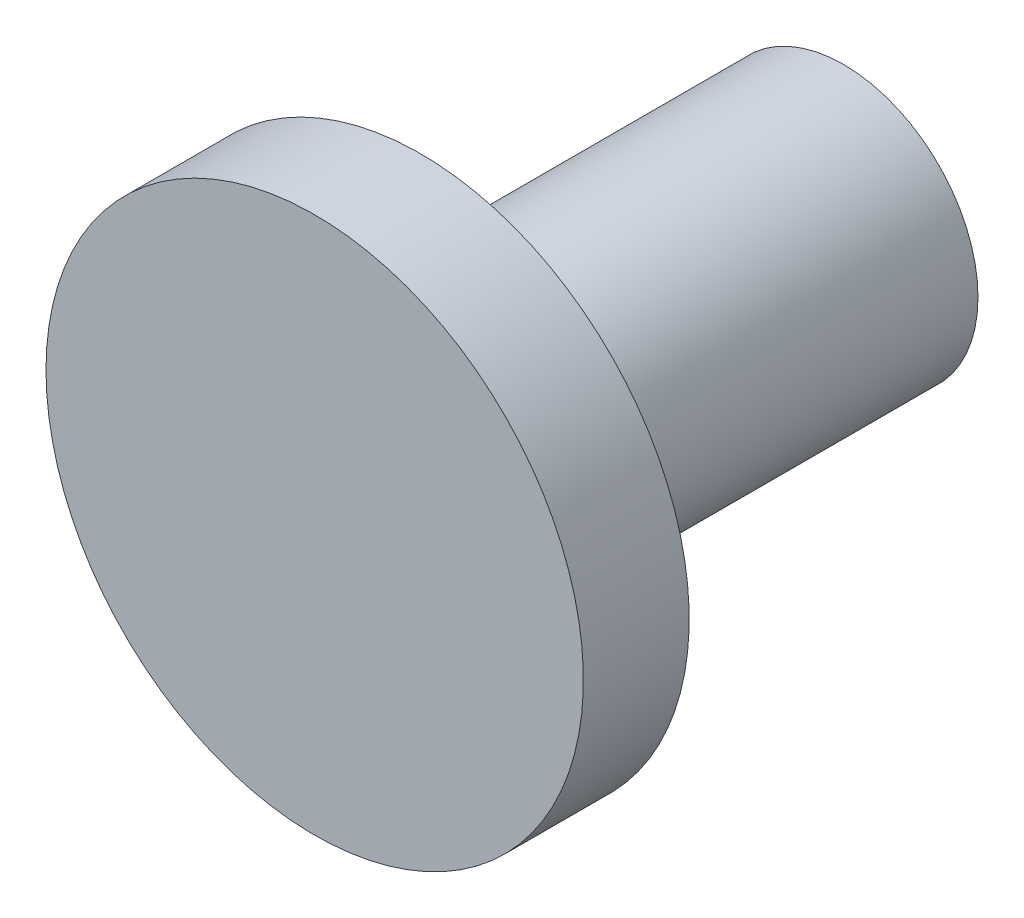
ISO-10303-21;
HEADER;
FILE_DESCRIPTION(('STEP AP214'),'2;1');
FILE_NAME('part.step','',(''),(''),'','','');
FILE_SCHEMA(('AUTOMOTIVE_DESIGN { 1 0 10303 214 1 1 1 1 }'));
ENDSEC;
DATA;
#1=APPLICATION_CONTEXT('core data for automotive mechanical design processes');
#2=APPLICATION_PROTOCOL_DEFINITION('international standard','automotive_design',2000,#1);
#3=PRODUCT_CONTEXT('',#1,'mechanical');
#4=PRODUCT('Part','Part','',(#3));
#5=PRODUCT_RELATED_PRODUCT_CATEGORY('part','',(#4));
#6=PRODUCT_DEFINITION_FORMATION('','',#4);
#7=PRODUCT_DEFINITION_CONTEXT('part definition',#1,'design');
#8=PRODUCT_DEFINITION('design','',#6,#7);
#9=PRODUCT_DEFINITION_SHAPE('','',#8);
#10=(LENGTH_UNIT() NAMED_UNIT(*) SI_UNIT(.MILLI.,.METRE.));
#11=(NAMED_UNIT(*) PLANE_ANGLE_UNIT() SI_UNIT($,.RADIAN.));
#12=(NAMED_UNIT(*) SI_UNIT($,.STERADIAN.) SOLID_ANGLE_UNIT());
#13=UNCERTAINTY_MEASURE_WITH_UNIT(LENGTH_MEASURE(1.E-05),#10,'distance_accuracy_value','');
#14=(GEOMETRIC_REPRESENTATION_CONTEXT(3) GLOBAL_UNCERTAINTY_ASSIGNED_CONTEXT((#13)) GLOBAL_UNIT_ASSIGNED_CONTEXT((#10,
#11,#12)) REPRESENTATION_CONTEXT('',''));
#15=CARTESIAN_POINT('',(0.,0.,0.));
#16=DIRECTION('',(0.,0.,1.));
#17=DIRECTION('',(1.,0.,0.));
#18=AXIS2_PLACEMENT_3D('',#15,#16,#17);
#19=CARTESIAN_POINT('',(0.,0.,-20.));
#20=DIRECTION('',(0.,0.,-1.));
#21=DIRECTION('',(-1.,0.,0.));
#22=AXIS2_PLACEMENT_3D('',#19,#20,#21);
#23=PLANE('',#22);
#24=CARTESIAN_POINT('',(0.,0.,-20.));
#25=DIRECTION('',(0.,0.,1.));
#26=DIRECTION('',(1.,0.,0.));
#27=AXIS2_PLACEMENT_3D('',#24,#25,#26);
#28=CIRCLE('',#27,6.35);
#29=CARTESIAN_POINT('',(6.35,0.,-20.));
#30=VERTEX_POINT('',#29);
#31=EDGE_CURVE('E18',#30,#30,#28,.T.);
#32=ORIENTED_EDGE('',*,*,#31,.F.);
#33=EDGE_LOOP('',(#32));
#34=FACE_BOUND('',#33,.T.);
#35=ADVANCED_FACE('F15',(#34),#23,.T.);
#36=CARTESIAN_POINT('',(0.,0.,-20.));
#37=DIRECTION('',(0.,0.,1.));
#38=DIRECTION('',(1.,0.,0.));
#39=AXIS2_PLACEMENT_3D('',#36,#37,#38);
#40=CYLINDRICAL_SURFACE('',#39,6.35);
#41=ORIENTED_EDGE('',*,*,#31,.T.);
#42=EDGE_LOOP('',(#41));
#43=FACE_BOUND('',#42,.T.);
#44=CARTESIAN_POINT('',(0.,0.,0.));
#45=DIRECTION('',(0.,0.,1.));
#46=DIRECTION('',(1.,0.,0.));
#47=AXIS2_PLACEMENT_3D('',#44,#45,#46);
#48=CIRCLE('',#47,6.35);
#49=CARTESIAN_POINT('',(6.35,0.,0.));
#50=VERTEX_POINT('',#49);
#51=EDGE_CURVE('E27',#50,#50,#48,.F.);
#52=ORIENTED_EDGE('',*,*,#51,.T.);
#53=EDGE_LOOP('',(#52));
#54=FACE_BOUND('',#53,.T.);
#55=ADVANCED_FACE('F35',(#43,#54),#40,.T.);
#56=CARTESIAN_POINT('',(0.,0.,0.));
#57=DIRECTION('',(0.,0.,1.));
#58=DIRECTION('',(1.,0.,0.));
#59=AXIS2_PLACEMENT_3D('',#56,#57,#58);
#60=PLANE('',#59);
#61=CARTESIAN_POINT('',(0.,0.,0.));
#62=DIRECTION('',(0.,0.,-1.));
#63=DIRECTION('',(-1.,0.,0.));
#64=AXIS2_PLACEMENT_3D('',#61,#62,#63);
#65=CIRCLE('',#64,12.7);
#66=CARTESIAN_POINT('',(-12.7,0.,0.));
#67=VERTEX_POINT('',#66);
#68=EDGE_CURVE('E22',#67,#67,#65,.F.);
#69=ORIENTED_EDGE('',*,*,#68,.F.);
#70=EDGE_LOOP('',(#69));
#71=FACE_BOUND('',#70,.T.);
#72=ORIENTED_EDGE('',*,*,#51,.F.);
#73=EDGE_LOOP('',(#72));
#74=FACE_BOUND('',#73,.T.);
#75=ADVANCED_FACE('F42',(#71,#74),#60,.F.);
#76=CARTESIAN_POINT('',(0.,0.,5.));
#77=DIRECTION('',(0.,0.,-1.));
#78=DIRECTION('',(-1.,0.,0.));
#79=AXIS2_PLACEMENT_3D('',#76,#77,#78);
#80=CYLINDRICAL_SURFACE('',#79,12.7);
#81=ORIENTED_EDGE('',*,*,#68,.T.);
#82=EDGE_LOOP('',(#81));
#83=FACE_BOUND('',#82,.T.);
#84=CARTESIAN_POINT('',(0.,0.,5.));
#85=DIRECTION('',(0.,0.,-1.));
#86=DIRECTION('',(-1.,0.,0.));
#87=AXIS2_PLACEMENT_3D('',#84,#85,#86);
#88=CIRCLE('',#87,12.7);
#89=CARTESIAN_POINT('',(-12.7,0.,5.));
#90=VERTEX_POINT('',#89);
#91=EDGE_CURVE('E10',#90,#90,#88,.F.);
#92=ORIENTED_EDGE('',*,*,#91,.F.);
#93=EDGE_LOOP('',(#92));
#94=FACE_BOUND('',#93,.T.);
#95=ADVANCED_FACE('F45',(#83,#94),#80,.T.);
#96=CARTESIAN_POINT('',(0.,0.,5.));
#97=DIRECTION('',(0.,0.,1.));
#98=DIRECTION('',(1.,0.,0.));
#99=AXIS2_PLACEMENT_3D('',#96,#97,#98);
#100=PLANE('',#99);
#101=ORIENTED_EDGE('',*,*,#91,.T.);
#102=EDGE_LOOP('',(#101));
#103=FACE_BOUND('',#102,.T.);
#104=ADVANCED_FACE('F43',(#103),#100,.T.);
#105=CLOSED_SHELL('',(#35,#55,#75,#95,#104));
#106=MANIFOLD_SOLID_BREP('B1',#105);
#107=ADVANCED_BREP_SHAPE_REPRESENTATION('',(#18,#106),#14);
#108=SHAPE_DEFINITION_REPRESENTATION(#9,#107);
ENDSEC;
END-ISO-10303-21;
